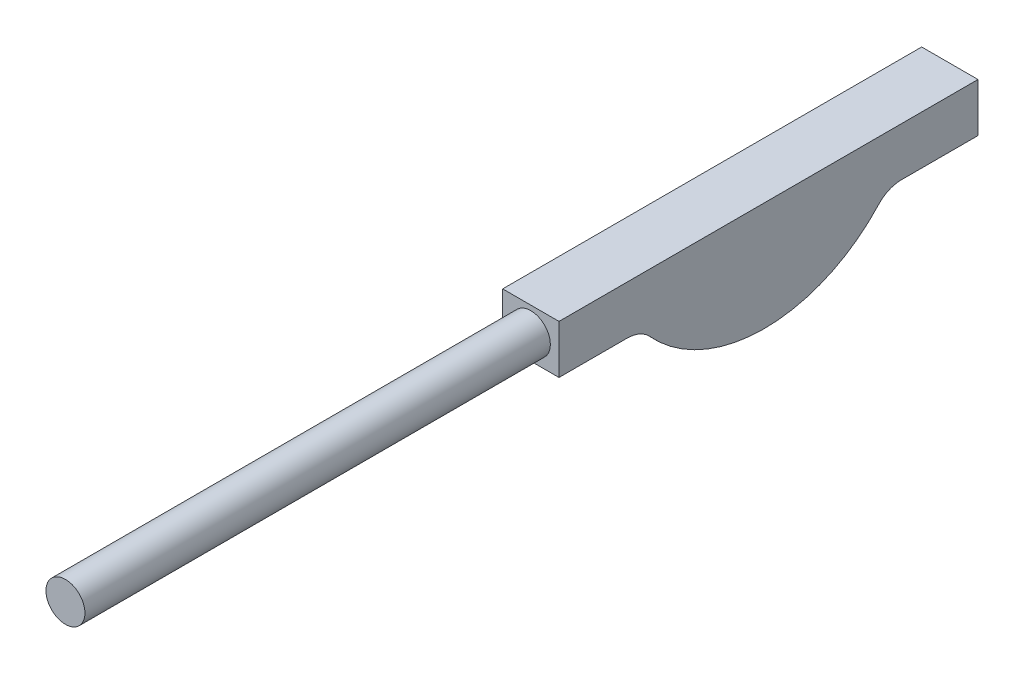
ISO-10303-21;
HEADER;
FILE_DESCRIPTION(('STEP AP214'),'2;1');
FILE_NAME('part.step','',(''),(''),'','','');
FILE_SCHEMA(('AUTOMOTIVE_DESIGN { 1 0 10303 214 1 1 1 1 }'));
ENDSEC;
DATA;
#1=APPLICATION_CONTEXT('core data for automotive mechanical design processes');
#2=APPLICATION_PROTOCOL_DEFINITION('international standard','automotive_design',2000,#1);
#3=PRODUCT_CONTEXT('',#1,'mechanical');
#4=PRODUCT('Part','Part','',(#3));
#5=PRODUCT_RELATED_PRODUCT_CATEGORY('part','',(#4));
#6=PRODUCT_DEFINITION_FORMATION('','',#4);
#7=PRODUCT_DEFINITION_CONTEXT('part definition',#1,'design');
#8=PRODUCT_DEFINITION('design','',#6,#7);
#9=PRODUCT_DEFINITION_SHAPE('','',#8);
#10=(LENGTH_UNIT() NAMED_UNIT(*) SI_UNIT(.MILLI.,.METRE.));
#11=(NAMED_UNIT(*) PLANE_ANGLE_UNIT() SI_UNIT($,.RADIAN.));
#12=(NAMED_UNIT(*) SI_UNIT($,.STERADIAN.) SOLID_ANGLE_UNIT());
#13=UNCERTAINTY_MEASURE_WITH_UNIT(LENGTH_MEASURE(1.E-05),#10,'distance_accuracy_value','');
#14=(GEOMETRIC_REPRESENTATION_CONTEXT(3) GLOBAL_UNCERTAINTY_ASSIGNED_CONTEXT((#13)) GLOBAL_UNIT_ASSIGNED_CONTEXT((#10,
#11,#12)) REPRESENTATION_CONTEXT('',''));
#15=CARTESIAN_POINT('',(0.,0.,0.));
#16=DIRECTION('',(0.,0.,1.));
#17=DIRECTION('',(1.,0.,0.));
#18=AXIS2_PLACEMENT_3D('',#15,#16,#17);
#19=CARTESIAN_POINT('',(0.,0.,-46.1526272585934));
#20=DIRECTION('',(0.,0.,1.));
#21=DIRECTION('',(1.,0.,0.));
#22=AXIS2_PLACEMENT_3D('',#19,#20,#21);
#23=CYLINDRICAL_SURFACE('',#22,25.5293751023041);
#24=CARTESIAN_POINT('',(0.,0.,-46.1526272585934));
#25=DIRECTION('',(0.,0.,1.));
#26=DIRECTION('',(1.,0.,0.));
#27=AXIS2_PLACEMENT_3D('',#24,#25,#26);
#28=CIRCLE('',#27,25.5293751023041);
#29=CARTESIAN_POINT('',(25.5293751023041,0.,-46.1526272585934));
#30=VERTEX_POINT('',#29);
#31=EDGE_CURVE('E138',#30,#30,#28,.F.);
#32=ORIENTED_EDGE('',*,*,#31,.F.);
#33=EDGE_LOOP('',(#32));
#34=FACE_BOUND('',#33,.T.);
#35=CARTESIAN_POINT('',(2.70716782324598E-13,0.,563.447372741407));
#36=DIRECTION('',(0.,0.,1.));
#37=DIRECTION('',(1.,0.,0.));
#38=AXIS2_PLACEMENT_3D('',#35,#36,#37);
#39=CIRCLE('',#38,25.5293751023041);
#40=CARTESIAN_POINT('',(25.5293751023044,0.,563.447372741407));
#41=VERTEX_POINT('',#40);
#42=EDGE_CURVE('E133',#41,#41,#39,.T.);
#43=ORIENTED_EDGE('',*,*,#42,.F.);
#44=EDGE_LOOP('',(#43));
#45=FACE_BOUND('',#44,.T.);
#46=ADVANCED_FACE('F33',(#34,#45),#23,.T.);
#47=CARTESIAN_POINT('',(-36.8865234246576,-15.2091733486119,-320.384758481863));
#48=DIRECTION('',(1.,0.,0.));
#49=DIRECTION('',(0.,0.,-1.));
#50=AXIS2_PLACEMENT_3D('',#47,#48,#49);
#51=PLANE('',#50);
#52=DIRECTION('',(0.,0.,-1.));
#53=VECTOR('',#52,1.);
#54=CARTESIAN_POINT('',(-36.8865234246574,-31.8248286001554,-46.1526272585934));
#55=LINE('',#54,#53);
#56=CARTESIAN_POINT('',(-36.8865234246574,-31.8248286001554,-46.1526272585934));
#57=VERTEX_POINT('',#56);
#58=CARTESIAN_POINT('',(-36.8865234246575,-31.8248286001554,-135.418470768422));
#59=VERTEX_POINT('',#58);
#60=EDGE_CURVE('E112',#57,#59,#55,.T.);
#61=ORIENTED_EDGE('',*,*,#60,.F.);
#62=DIRECTION('',(0.,-1.,0.));
#63=VECTOR('',#62,1.);
#64=CARTESIAN_POINT('',(-36.8865234246574,31.8248286001554,-46.1526272585934));
#65=LINE('',#64,#63);
#66=CARTESIAN_POINT('',(-36.8865234246576,31.8248286001554,-46.1526272585935));
#67=VERTEX_POINT('',#66);
#68=EDGE_CURVE('E127',#67,#57,#65,.T.);
#69=ORIENTED_EDGE('',*,*,#68,.F.);
#70=DIRECTION('',(0.,0.,1.));
#71=VECTOR('',#70,1.);
#72=CARTESIAN_POINT('',(-36.8865234246579,31.8248286001554,-594.999059057791));
#73=LINE('',#72,#71);
#74=CARTESIAN_POINT('',(-36.8865234246578,31.8248286001554,-594.999059057791));
#75=VERTEX_POINT('',#74);
#76=EDGE_CURVE('E141',#75,#67,#73,.T.);
#77=ORIENTED_EDGE('',*,*,#76,.F.);
#78=DIRECTION('',(0.,1.,0.));
#79=VECTOR('',#78,1.);
#80=CARTESIAN_POINT('',(-36.8865234246578,-31.8248286001554,-594.999059057791));
#81=LINE('',#80,#79);
#82=CARTESIAN_POINT('',(-36.8865234246578,-31.8248286001554,-594.999059057791));
#83=VERTEX_POINT('',#82);
#84=EDGE_CURVE('E151',#83,#75,#81,.T.);
#85=ORIENTED_EDGE('',*,*,#84,.F.);
#86=DIRECTION('',(0.,0.,-1.));
#87=VECTOR('',#86,1.);
#88=CARTESIAN_POINT('',(-36.8865234246578,-31.8248286001554,-494.766076117919));
#89=LINE('',#88,#87);
#90=CARTESIAN_POINT('',(-36.8865234246577,-31.8248286001554,-494.766076117919));
#91=VERTEX_POINT('',#90);
#92=EDGE_CURVE('E161',#91,#83,#89,.T.);
#93=ORIENTED_EDGE('',*,*,#92,.F.);
#94=CARTESIAN_POINT('',(-36.8865234246577,-72.4648286001553,-494.766076117919));
#95=DIRECTION('',(-1.,0.,0.));
#96=DIRECTION('',(0.,0.,1.));
#97=AXIS2_PLACEMENT_3D('',#94,#95,#96);
#98=CIRCLE('',#97,40.64);
#99=CARTESIAN_POINT('',(-36.8865234246577,-45.0003531127429,-464.810906510632));
#100=VERTEX_POINT('',#99);
#101=EDGE_CURVE('E101',#100,#91,#98,.T.);
#102=ORIENTED_EDGE('',*,*,#101,.F.);
#103=CARTESIAN_POINT('',(-36.8865234246576,92.302460861979,-315.056396104794));
#104=DIRECTION('',(-1.,0.,0.));
#105=DIRECTION('',(0.,0.,1.));
#106=AXIS2_PLACEMENT_3D('',#103,#104,#105);
#107=CIRCLE('',#106,203.171051363794);
#108=CARTESIAN_POINT('',(-36.8865234246575,-43.6297440592713,-164.056688232505));
#109=VERTEX_POINT('',#108);
#110=EDGE_CURVE('E98',#109,#100,#107,.F.);
#111=ORIENTED_EDGE('',*,*,#110,.F.);
#112=CARTESIAN_POINT('',(-36.8865234246575,-72.4648286001553,-135.418470768422));
#113=DIRECTION('',(-1.,0.,0.));
#114=DIRECTION('',(0.,0.,1.));
#115=AXIS2_PLACEMENT_3D('',#112,#113,#114);
#116=CIRCLE('',#115,40.64);
#117=EDGE_CURVE('E36',#59,#109,#116,.T.);
#118=ORIENTED_EDGE('',*,*,#117,.F.);
#119=EDGE_LOOP('',(#61,#69,#77,#85,#93,#102,#111,#118));
#120=FACE_BOUND('',#119,.T.);
#121=ADVANCED_FACE('F99',(#120),#51,.F.);
#122=CARTESIAN_POINT('',(36.8865234246574,-31.8248286001554,-46.1526272585934));
#123=DIRECTION('',(0.,-1.,0.));
#124=DIRECTION('',(0.,0.,-1.));
#125=AXIS2_PLACEMENT_3D('',#122,#123,#124);
#126=PLANE('',#125);
#127=DIRECTION('',(0.,0.,-1.));
#128=VECTOR('',#127,1.);
#129=CARTESIAN_POINT('',(36.886523424657,-31.8248286001554,-320.384758481863));
#130=LINE('',#129,#128);
#131=CARTESIAN_POINT('',(36.8865234246573,-31.8248286001554,-46.1526272585934));
#132=VERTEX_POINT('',#131);
#133=CARTESIAN_POINT('',(36.8865234246572,-31.8248286001554,-135.418470768422));
#134=VERTEX_POINT('',#133);
#135=EDGE_CURVE('E148',#132,#134,#130,.T.);
#136=ORIENTED_EDGE('',*,*,#135,.F.);
#137=DIRECTION('',(1.,0.,0.));
#138=VECTOR('',#137,1.);
#139=CARTESIAN_POINT('',(36.8865234246573,-31.8248286001554,-46.1526272585934));
#140=LINE('',#139,#138);
#141=EDGE_CURVE('E124',#57,#132,#140,.T.);
#142=ORIENTED_EDGE('',*,*,#141,.F.);
#143=ORIENTED_EDGE('',*,*,#60,.T.);
#144=DIRECTION('',(-1.,0.,0.));
#145=VECTOR('',#144,1.);
#146=CARTESIAN_POINT('',(36.8865234246571,-31.8248286001553,-135.418470768422));
#147=LINE('',#146,#145);
#148=EDGE_CURVE('E106',#134,#59,#147,.T.);
#149=ORIENTED_EDGE('',*,*,#148,.F.);
#150=EDGE_LOOP('',(#136,#142,#143,#149));
#151=FACE_BOUND('',#150,.T.);
#152=ADVANCED_FACE('F218',(#151),#126,.T.);
#153=CARTESIAN_POINT('',(36.8865234246572,-72.4648286001553,-135.418470768422));
#154=DIRECTION('',(-1.,0.,0.));
#155=DIRECTION('',(0.,0.,1.));
#156=AXIS2_PLACEMENT_3D('',#153,#154,#155);
#157=CYLINDRICAL_SURFACE('',#156,40.64);
#158=CARTESIAN_POINT('',(36.8865234246572,-72.4648286001553,-135.418470768422));
#159=DIRECTION('',(-1.,0.,0.));
#160=DIRECTION('',(0.,0.,1.));
#161=AXIS2_PLACEMENT_3D('',#158,#159,#160);
#162=CIRCLE('',#161,40.64);
#163=CARTESIAN_POINT('',(36.8865234246572,-43.6297440592713,-164.056688232505));
#164=VERTEX_POINT('',#163);
#165=EDGE_CURVE('E171',#134,#164,#162,.T.);
#166=ORIENTED_EDGE('',*,*,#165,.F.);
#167=ORIENTED_EDGE('',*,*,#148,.T.);
#168=ORIENTED_EDGE('',*,*,#117,.T.);
#169=DIRECTION('',(-1.,0.,0.));
#170=VECTOR('',#169,1.);
#171=CARTESIAN_POINT('',(36.886523424657,-43.6297440592699,-164.056688232503));
#172=LINE('',#171,#170);
#173=EDGE_CURVE('E105',#164,#109,#172,.T.);
#174=ORIENTED_EDGE('',*,*,#173,.F.);
#175=EDGE_LOOP('',(#166,#167,#168,#174));
#176=FACE_BOUND('',#175,.T.);
#177=ADVANCED_FACE('F110',(#176),#157,.F.);
#178=CARTESIAN_POINT('',(36.886523424657,92.302460861979,-315.056396104794));
#179=DIRECTION('',(-1.,0.,0.));
#180=DIRECTION('',(0.,0.,1.));
#181=AXIS2_PLACEMENT_3D('',#178,#179,#180);
#182=CYLINDRICAL_SURFACE('',#181,203.171051363794);
#183=CARTESIAN_POINT('',(36.8865234246571,92.302460861979,-315.056396104794));
#184=DIRECTION('',(-1.,0.,0.));
#185=DIRECTION('',(0.,0.,1.));
#186=AXIS2_PLACEMENT_3D('',#183,#184,#185);
#187=CIRCLE('',#186,203.171051363794);
#188=CARTESIAN_POINT('',(36.8865234246569,-45.000353112743,-464.810906510632));
#189=VERTEX_POINT('',#188);
#190=EDGE_CURVE('E115',#164,#189,#187,.F.);
#191=ORIENTED_EDGE('',*,*,#190,.F.);
#192=ORIENTED_EDGE('',*,*,#173,.T.);
#193=ORIENTED_EDGE('',*,*,#110,.T.);
#194=DIRECTION('',(-1.,0.,0.));
#195=VECTOR('',#194,1.);
#196=CARTESIAN_POINT('',(36.8865234246569,-45.0003531127429,-464.810906510632));
#197=LINE('',#196,#195);
#198=EDGE_CURVE('E118',#189,#100,#197,.T.);
#199=ORIENTED_EDGE('',*,*,#198,.F.);
#200=EDGE_LOOP('',(#191,#192,#193,#199));
#201=FACE_BOUND('',#200,.T.);
#202=ADVANCED_FACE('F113',(#201),#182,.T.);
#203=CARTESIAN_POINT('',(36.8865234246569,-72.4648286001553,-494.766076117919));
#204=DIRECTION('',(-1.,0.,0.));
#205=DIRECTION('',(0.,0.,1.));
#206=AXIS2_PLACEMENT_3D('',#203,#204,#205);
#207=CYLINDRICAL_SURFACE('',#206,40.64);
#208=CARTESIAN_POINT('',(36.8865234246569,-72.4648286001553,-494.766076117919));
#209=DIRECTION('',(-1.,0.,0.));
#210=DIRECTION('',(0.,0.,1.));
#211=AXIS2_PLACEMENT_3D('',#208,#209,#210);
#212=CIRCLE('',#211,40.64);
#213=CARTESIAN_POINT('',(36.8865234246569,-31.8248286001554,-494.766076117919));
#214=VERTEX_POINT('',#213);
#215=EDGE_CURVE('E166',#189,#214,#212,.T.);
#216=ORIENTED_EDGE('',*,*,#215,.F.);
#217=ORIENTED_EDGE('',*,*,#198,.T.);
#218=ORIENTED_EDGE('',*,*,#101,.T.);
#219=DIRECTION('',(1.,0.,0.));
#220=VECTOR('',#219,1.);
#221=CARTESIAN_POINT('',(36.8865234246569,-31.8248286001554,-494.766076117919));
#222=LINE('',#221,#220);
#223=EDGE_CURVE('E154',#214,#91,#222,.F.);
#224=ORIENTED_EDGE('',*,*,#223,.F.);
#225=EDGE_LOOP('',(#216,#217,#218,#224));
#226=FACE_BOUND('',#225,.T.);
#227=ADVANCED_FACE('F213',(#226),#207,.F.);
#228=CARTESIAN_POINT('',(36.8865234246569,-31.8248286001554,-494.766076117919));
#229=DIRECTION('',(0.,-1.,0.));
#230=DIRECTION('',(0.,0.,-1.));
#231=AXIS2_PLACEMENT_3D('',#228,#229,#230);
#232=PLANE('',#231);
#233=DIRECTION('',(0.,0.,-1.));
#234=VECTOR('',#233,1.);
#235=CARTESIAN_POINT('',(36.886523424657,-31.8248286001554,-320.384758481863));
#236=LINE('',#235,#234);
#237=CARTESIAN_POINT('',(36.8865234246568,-31.8248286001554,-594.999059057791));
#238=VERTEX_POINT('',#237);
#239=EDGE_CURVE('E169',#214,#238,#236,.T.);
#240=ORIENTED_EDGE('',*,*,#239,.F.);
#241=ORIENTED_EDGE('',*,*,#223,.T.);
#242=ORIENTED_EDGE('',*,*,#92,.T.);
#243=DIRECTION('',(-1.,0.,0.));
#244=VECTOR('',#243,1.);
#245=CARTESIAN_POINT('',(36.8865234246569,-31.8248286001554,-594.999059057791));
#246=LINE('',#245,#244);
#247=EDGE_CURVE('E144',#238,#83,#246,.T.);
#248=ORIENTED_EDGE('',*,*,#247,.F.);
#249=EDGE_LOOP('',(#240,#241,#242,#248));
#250=FACE_BOUND('',#249,.T.);
#251=ADVANCED_FACE('F210',(#250),#232,.T.);
#252=CARTESIAN_POINT('',(36.8865234246569,-31.8248286001554,-594.999059057791));
#253=DIRECTION('',(0.,0.,-1.));
#254=DIRECTION('',(-1.,0.,0.));
#255=AXIS2_PLACEMENT_3D('',#252,#253,#254);
#256=PLANE('',#255);
#257=DIRECTION('',(0.,1.,0.));
#258=VECTOR('',#257,1.);
#259=CARTESIAN_POINT('',(36.8865234246568,-15.2091733486119,-594.999059057791));
#260=LINE('',#259,#258);
#261=CARTESIAN_POINT('',(36.8865234246569,31.8248286001554,-594.999059057791));
#262=VERTEX_POINT('',#261);
#263=EDGE_CURVE('E188',#238,#262,#260,.T.);
#264=ORIENTED_EDGE('',*,*,#263,.F.);
#265=ORIENTED_EDGE('',*,*,#247,.T.);
#266=ORIENTED_EDGE('',*,*,#84,.T.);
#267=DIRECTION('',(1.,0.,0.));
#268=VECTOR('',#267,1.);
#269=CARTESIAN_POINT('',(36.8865234246568,31.8248286001554,-594.999059057791));
#270=LINE('',#269,#268);
#271=EDGE_CURVE('E143',#262,#75,#270,.F.);
#272=ORIENTED_EDGE('',*,*,#271,.F.);
#273=EDGE_LOOP('',(#264,#265,#266,#272));
#274=FACE_BOUND('',#273,.T.);
#275=ADVANCED_FACE('F207',(#274),#256,.T.);
#276=CARTESIAN_POINT('',(36.8865234246568,31.8248286001554,-594.999059057791));
#277=DIRECTION('',(0.,1.,0.));
#278=DIRECTION('',(0.,0.,1.));
#279=AXIS2_PLACEMENT_3D('',#276,#277,#278);
#280=PLANE('',#279);
#281=DIRECTION('',(0.,0.,-1.));
#282=VECTOR('',#281,1.);
#283=CARTESIAN_POINT('',(36.886523424657,31.8248286001554,-320.384758481863));
#284=LINE('',#283,#282);
#285=CARTESIAN_POINT('',(36.8865234246573,31.8248286001554,-46.1526272585935));
#286=VERTEX_POINT('',#285);
#287=EDGE_CURVE('E42',#262,#286,#284,.F.);
#288=ORIENTED_EDGE('',*,*,#287,.F.);
#289=ORIENTED_EDGE('',*,*,#271,.T.);
#290=ORIENTED_EDGE('',*,*,#76,.T.);
#291=DIRECTION('',(1.,0.,0.));
#292=VECTOR('',#291,1.);
#293=CARTESIAN_POINT('',(36.8865234246573,31.8248286001554,-46.1526272585934));
#294=LINE('',#293,#292);
#295=EDGE_CURVE('E51',#286,#67,#294,.F.);
#296=ORIENTED_EDGE('',*,*,#295,.F.);
#297=EDGE_LOOP('',(#288,#289,#290,#296));
#298=FACE_BOUND('',#297,.T.);
#299=ADVANCED_FACE('F220',(#298),#280,.T.);
#300=CARTESIAN_POINT('',(36.8865234246573,31.8248286001554,-46.1526272585934));
#301=DIRECTION('',(0.,0.,1.));
#302=DIRECTION('',(0.,-1.,0.));
#303=AXIS2_PLACEMENT_3D('',#300,#301,#302);
#304=PLANE('',#303);
#305=DIRECTION('',(0.,1.,0.));
#306=VECTOR('',#305,1.);
#307=CARTESIAN_POINT('',(36.8865234246573,-15.2091733486119,-46.1526272585934));
#308=LINE('',#307,#306);
#309=EDGE_CURVE('E11',#286,#132,#308,.F.);
#310=ORIENTED_EDGE('',*,*,#309,.F.);
#311=ORIENTED_EDGE('',*,*,#295,.T.);
#312=ORIENTED_EDGE('',*,*,#68,.T.);
#313=ORIENTED_EDGE('',*,*,#141,.T.);
#314=EDGE_LOOP('',(#310,#311,#312,#313));
#315=FACE_BOUND('',#314,.T.);
#316=ORIENTED_EDGE('',*,*,#31,.T.);
#317=EDGE_LOOP('',(#316));
#318=FACE_BOUND('',#317,.T.);
#319=ADVANCED_FACE('F176',(#315,#318),#304,.T.);
#320=CARTESIAN_POINT('',(36.886523424657,-15.2091733486119,-320.384758481863));
#321=DIRECTION('',(1.,0.,0.));
#322=DIRECTION('',(0.,0.,-1.));
#323=AXIS2_PLACEMENT_3D('',#320,#321,#322);
#324=PLANE('',#323);
#325=ORIENTED_EDGE('',*,*,#287,.T.);
#326=ORIENTED_EDGE('',*,*,#309,.T.);
#327=ORIENTED_EDGE('',*,*,#135,.T.);
#328=ORIENTED_EDGE('',*,*,#165,.T.);
#329=ORIENTED_EDGE('',*,*,#190,.T.);
#330=ORIENTED_EDGE('',*,*,#215,.T.);
#331=ORIENTED_EDGE('',*,*,#239,.T.);
#332=ORIENTED_EDGE('',*,*,#263,.T.);
#333=EDGE_LOOP('',(#325,#326,#327,#328,#329,#330,#331,#332));
#334=FACE_BOUND('',#333,.T.);
#335=ADVANCED_FACE('F215',(#334),#324,.T.);
#336=CARTESIAN_POINT('',(2.70716782324598E-13,0.,563.447372741407));
#337=DIRECTION('',(0.,0.,1.));
#338=DIRECTION('',(1.,0.,0.));
#339=AXIS2_PLACEMENT_3D('',#336,#337,#338);
#340=PLANE('',#339);
#341=ORIENTED_EDGE('',*,*,#42,.T.);
#342=EDGE_LOOP('',(#341));
#343=FACE_BOUND('',#342,.T.);
#344=ADVANCED_FACE('F180',(#343),#340,.T.);
#345=CLOSED_SHELL('',(#46,#121,#152,#177,#202,#227,#251,#275,#299,#319,#335,#344));
#346=MANIFOLD_SOLID_BREP('B2',#345);
#347=ADVANCED_BREP_SHAPE_REPRESENTATION('',(#18,#346),#14);
#348=SHAPE_DEFINITION_REPRESENTATION(#9,#347);
ENDSEC;
END-ISO-10303-21;
